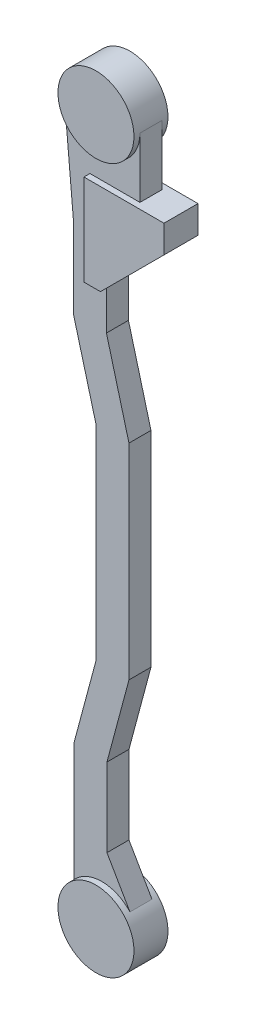
ISO-10303-21;
HEADER;
FILE_DESCRIPTION(('STEP AP214'),'2;1');
FILE_NAME('part.step','',(''),(''),'','','');
FILE_SCHEMA(('AUTOMOTIVE_DESIGN { 1 0 10303 214 1 1 1 1 }'));
ENDSEC;
DATA;
#1=APPLICATION_CONTEXT('core data for automotive mechanical design processes');
#2=APPLICATION_PROTOCOL_DEFINITION('international standard','automotive_design',2000,#1);
#3=PRODUCT_CONTEXT('',#1,'mechanical');
#4=PRODUCT('Part','Part','',(#3));
#5=PRODUCT_RELATED_PRODUCT_CATEGORY('part','',(#4));
#6=PRODUCT_DEFINITION_FORMATION('','',#4);
#7=PRODUCT_DEFINITION_CONTEXT('part definition',#1,'design');
#8=PRODUCT_DEFINITION('design','',#6,#7);
#9=PRODUCT_DEFINITION_SHAPE('','',#8);
#10=(LENGTH_UNIT() NAMED_UNIT(*) SI_UNIT(.MILLI.,.METRE.));
#11=(NAMED_UNIT(*) PLANE_ANGLE_UNIT() SI_UNIT($,.RADIAN.));
#12=(NAMED_UNIT(*) SI_UNIT($,.STERADIAN.) SOLID_ANGLE_UNIT());
#13=UNCERTAINTY_MEASURE_WITH_UNIT(LENGTH_MEASURE(1.E-05),#10,'distance_accuracy_value','');
#14=(GEOMETRIC_REPRESENTATION_CONTEXT(3) GLOBAL_UNCERTAINTY_ASSIGNED_CONTEXT((#13)) GLOBAL_UNIT_ASSIGNED_CONTEXT((#10,
#11,#12)) REPRESENTATION_CONTEXT('',''));
#15=CARTESIAN_POINT('',(0.,0.,0.));
#16=DIRECTION('',(0.,0.,1.));
#17=DIRECTION('',(1.,0.,0.));
#18=AXIS2_PLACEMENT_3D('',#15,#16,#17);
#19=CARTESIAN_POINT('',(0.,0.,-11.));
#20=DIRECTION('',(0.,0.,1.));
#21=DIRECTION('',(1.,0.,0.));
#22=AXIS2_PLACEMENT_3D('',#19,#20,#21);
#23=PLANE('',#22);
#24=DIRECTION('',(-0.499999999999995,0.866025403784442,0.));
#25=VECTOR('',#24,1.);
#26=CARTESIAN_POINT('',(32.1242977306436,18.5469719423145,-11.));
#27=LINE('',#26,#25);
#28=CARTESIAN_POINT('',(28.,25.6904651573302,-11.));
#29=VERTEX_POINT('',#28);
#30=CARTESIAN_POINT('',(5.00000000000006,65.5276337314149,-11.));
#31=VERTEX_POINT('',#30);
#32=EDGE_CURVE('E194',#29,#31,#27,.T.);
#33=ORIENTED_EDGE('',*,*,#32,.F.);
#34=CARTESIAN_POINT('',(0.,0.,-11.));
#35=DIRECTION('',(0.,0.,1.));
#36=DIRECTION('',(1.,0.,0.));
#37=AXIS2_PLACEMENT_3D('',#34,#35,#36);
#38=CIRCLE('',#37,38.);
#39=CARTESIAN_POINT('',(-28.,25.6904651573302,-11.));
#40=VERTEX_POINT('',#39);
#41=EDGE_CURVE('E188',#29,#40,#38,.T.);
#42=ORIENTED_EDGE('',*,*,#41,.T.);
#43=DIRECTION('',(0.,1.,0.));
#44=VECTOR('',#43,1.);
#45=CARTESIAN_POINT('',(-28.,0.,-11.));
#46=LINE('',#45,#44);
#47=CARTESIAN_POINT('',(-28.,144.,-11.));
#48=VERTEX_POINT('',#47);
#49=EDGE_CURVE('E191',#40,#48,#46,.T.);
#50=ORIENTED_EDGE('',*,*,#49,.T.);
#51=DIRECTION('',(0.258819045102521,0.965925826289068,0.));
#52=VECTOR('',#51,1.);
#53=CARTESIAN_POINT('',(-62.1243556529822,16.6461709275205,-11.));
#54=LINE('',#53,#52);
#55=CARTESIAN_POINT('',(-6.00038116628569,226.103695234571,-11.));
#56=VERTEX_POINT('',#55);
#57=EDGE_CURVE('E214',#48,#56,#54,.T.);
#58=ORIENTED_EDGE('',*,*,#57,.T.);
#59=DIRECTION('',(0.,1.,0.));
#60=VECTOR('',#59,1.);
#61=CARTESIAN_POINT('',(-6.00038116628571,0.,-11.));
#62=LINE('',#61,#60);
#63=CARTESIAN_POINT('',(-6.00038116628567,431.103695234571,-11.));
#64=VERTEX_POINT('',#63);
#65=EDGE_CURVE('E218',#56,#64,#62,.T.);
#66=ORIENTED_EDGE('',*,*,#65,.T.);
#67=DIRECTION('',(-0.258819045102521,0.965925826289068,0.));
#68=VECTOR('',#67,1.);
#69=CARTESIAN_POINT('',(102.177491964304,27.3783764564728,-11.));
#70=LINE('',#69,#68);
#71=CARTESIAN_POINT('',(-28.5176380902051,515.13924212172,-11.));
#72=VERTEX_POINT('',#71);
#73=EDGE_CURVE('E346',#64,#72,#70,.T.);
#74=ORIENTED_EDGE('',*,*,#73,.T.);
#75=DIRECTION('',(0.,1.,0.));
#76=VECTOR('',#75,1.);
#77=CARTESIAN_POINT('',(-28.5176380902051,0.,-11.));
#78=LINE('',#77,#76);
#79=CARTESIAN_POINT('',(-28.5176380902051,596.13924212172,-11.));
#80=VERTEX_POINT('',#79);
#81=EDGE_CURVE('E344',#72,#80,#78,.T.);
#82=ORIENTED_EDGE('',*,*,#81,.T.);
#83=DIRECTION('',(-0.0881246018637952,0.996109459119001,0.));
#84=VECTOR('',#83,1.);
#85=CARTESIAN_POINT('',(24.0339739493017,2.12625667400073,-11.));
#86=LINE('',#85,#84);
#87=CARTESIAN_POINT('',(-37.852159446522,701.651265129176,-11.));
#88=VERTEX_POINT('',#87);
#89=EDGE_CURVE('E341',#80,#88,#86,.T.);
#90=ORIENTED_EDGE('',*,*,#89,.T.);
#91=CARTESIAN_POINT('',(0.,705.,-11.));
#92=DIRECTION('',(0.,0.,1.));
#93=DIRECTION('',(1.,0.,0.));
#94=AXIS2_PLACEMENT_3D('',#91,#92,#93);
#95=CIRCLE('',#94,38.);
#96=CARTESIAN_POINT('',(38.,705.,-11.));
#97=VERTEX_POINT('',#96);
#98=EDGE_CURVE('E365',#88,#97,#95,.T.);
#99=ORIENTED_EDGE('',*,*,#98,.T.);
#100=DIRECTION('',(0.,-1.,0.));
#101=VECTOR('',#100,1.);
#102=CARTESIAN_POINT('',(37.9999999999998,0.,-11.));
#103=LINE('',#102,#101);
#104=CARTESIAN_POINT('',(38.,645.,-11.));
#105=VERTEX_POINT('',#104);
#106=EDGE_CURVE('E338',#97,#105,#103,.T.);
#107=ORIENTED_EDGE('',*,*,#106,.T.);
#108=DIRECTION('',(-1.,0.,0.));
#109=VECTOR('',#108,1.);
#110=CARTESIAN_POINT('',(0.,645.,-11.));
#111=LINE('',#110,#109);
#112=CARTESIAN_POINT('',(-12.,645.,-11.));
#113=VERTEX_POINT('',#112);
#114=EDGE_CURVE('E293',#105,#113,#111,.T.);
#115=ORIENTED_EDGE('',*,*,#114,.T.);
#116=DIRECTION('',(0.,-1.,0.));
#117=VECTOR('',#116,1.);
#118=CARTESIAN_POINT('',(-11.9999999999999,0.,-11.));
#119=LINE('',#118,#117);
#120=CARTESIAN_POINT('',(-12.,553.982361909795,-11.));
#121=VERTEX_POINT('',#120);
#122=EDGE_CURVE('E296',#113,#121,#119,.T.);
#123=ORIENTED_EDGE('',*,*,#122,.T.);
#124=DIRECTION('',(-1.,0.,0.));
#125=VECTOR('',#124,1.);
#126=CARTESIAN_POINT('',(0.,553.982361909795,-11.));
#127=LINE('',#126,#125);
#128=CARTESIAN_POINT('',(4.48236190979494,553.982361909795,-11.));
#129=VERTEX_POINT('',#128);
#130=EDGE_CURVE('E299',#129,#121,#127,.T.);
#131=ORIENTED_EDGE('',*,*,#130,.F.);
#132=DIRECTION('',(0.,1.,0.));
#133=VECTOR('',#132,1.);
#134=CARTESIAN_POINT('',(4.482361909795,0.,-11.));
#135=LINE('',#134,#133);
#136=CARTESIAN_POINT('',(4.48236190979495,515.13924212172,-11.));
#137=VERTEX_POINT('',#136);
#138=EDGE_CURVE('E230',#137,#129,#135,.T.);
#139=ORIENTED_EDGE('',*,*,#138,.F.);
#140=DIRECTION('',(-0.258819045102521,0.965925826289068,0.));
#141=VECTOR('',#140,1.);
#142=CARTESIAN_POINT('',(132.966911126747,35.6283764564728,-11.));
#143=LINE('',#142,#141);
#144=CARTESIAN_POINT('',(26.9996188337143,431.103695234571,-11.));
#145=VERTEX_POINT('',#144);
#146=EDGE_CURVE('E227',#145,#137,#143,.T.);
#147=ORIENTED_EDGE('',*,*,#146,.F.);
#148=DIRECTION('',(0.,-1.,0.));
#149=VECTOR('',#148,1.);
#150=CARTESIAN_POINT('',(26.9996188337144,0.,-11.));
#151=LINE('',#150,#149);
#152=CARTESIAN_POINT('',(26.9996188337144,226.103695234571,-11.));
#153=VERTEX_POINT('',#152);
#154=EDGE_CURVE('E225',#145,#153,#151,.T.);
#155=ORIENTED_EDGE('',*,*,#154,.T.);
#156=DIRECTION('',(-0.258819045102521,-0.965925826289068,0.));
#157=VECTOR('',#156,1.);
#158=CARTESIAN_POINT('',(-31.3349364905389,8.39617092752044,-11.));
#159=LINE('',#158,#157);
#160=CARTESIAN_POINT('',(5.00000000000005,144.,-11.));
#161=VERTEX_POINT('',#160);
#162=EDGE_CURVE('E223',#153,#161,#159,.T.);
#163=ORIENTED_EDGE('',*,*,#162,.T.);
#164=DIRECTION('',(0.,-1.,0.));
#165=VECTOR('',#164,1.);
#166=CARTESIAN_POINT('',(5.00000000000007,0.,-11.));
#167=LINE('',#166,#165);
#168=EDGE_CURVE('E216',#161,#31,#167,.T.);
#169=ORIENTED_EDGE('',*,*,#168,.T.);
#170=EDGE_LOOP('',(#33,#42,#50,#58,#66,#74,#82,#90,#99,#107,#115,#123,#131,#139,#147,#155,#163,#169));
#171=FACE_BOUND('',#170,.T.);
#172=ADVANCED_FACE('F35',(#171),#23,.F.);
#173=CARTESIAN_POINT('',(0.,0.,11.));
#174=DIRECTION('',(0.,0.,1.));
#175=DIRECTION('',(1.,0.,0.));
#176=AXIS2_PLACEMENT_3D('',#173,#174,#175);
#177=PLANE('',#176);
#178=CARTESIAN_POINT('',(0.,0.,11.));
#179=DIRECTION('',(0.,0.,1.));
#180=DIRECTION('',(1.,0.,0.));
#181=AXIS2_PLACEMENT_3D('',#178,#179,#180);
#182=CIRCLE('',#181,38.);
#183=CARTESIAN_POINT('',(28.,25.6904651573302,11.));
#184=VERTEX_POINT('',#183);
#185=CARTESIAN_POINT('',(-28.,25.6904651573302,11.));
#186=VERTEX_POINT('',#185);
#187=EDGE_CURVE('E199',#184,#186,#182,.T.);
#188=ORIENTED_EDGE('',*,*,#187,.F.);
#189=DIRECTION('',(-0.499999999999995,0.866025403784442,0.));
#190=VECTOR('',#189,1.);
#191=CARTESIAN_POINT('',(32.1242977306436,18.5469719423145,11.));
#192=LINE('',#191,#190);
#193=CARTESIAN_POINT('',(5.00000000000006,65.5276337314149,11.));
#194=VERTEX_POINT('',#193);
#195=EDGE_CURVE('E321',#184,#194,#192,.T.);
#196=ORIENTED_EDGE('',*,*,#195,.T.);
#197=DIRECTION('',(0.,-1.,0.));
#198=VECTOR('',#197,1.);
#199=CARTESIAN_POINT('',(5.00000000000007,0.,11.));
#200=LINE('',#199,#198);
#201=CARTESIAN_POINT('',(5.00000000000005,144.,11.));
#202=VERTEX_POINT('',#201);
#203=EDGE_CURVE('E324',#202,#194,#200,.T.);
#204=ORIENTED_EDGE('',*,*,#203,.F.);
#205=DIRECTION('',(-0.258819045102521,-0.965925826289068,0.));
#206=VECTOR('',#205,1.);
#207=CARTESIAN_POINT('',(-31.3349364905389,8.39617092752044,11.));
#208=LINE('',#207,#206);
#209=CARTESIAN_POINT('',(26.9996188337144,226.103695234571,11.));
#210=VERTEX_POINT('',#209);
#211=EDGE_CURVE('E327',#210,#202,#208,.T.);
#212=ORIENTED_EDGE('',*,*,#211,.F.);
#213=DIRECTION('',(0.,-1.,0.));
#214=VECTOR('',#213,1.);
#215=CARTESIAN_POINT('',(26.9996188337144,0.,11.));
#216=LINE('',#215,#214);
#217=CARTESIAN_POINT('',(26.9996188337143,431.103695234571,11.));
#218=VERTEX_POINT('',#217);
#219=EDGE_CURVE('E330',#218,#210,#216,.T.);
#220=ORIENTED_EDGE('',*,*,#219,.F.);
#221=DIRECTION('',(-0.258819045102521,0.965925826289068,0.));
#222=VECTOR('',#221,1.);
#223=CARTESIAN_POINT('',(132.966911126747,35.6283764564728,11.));
#224=LINE('',#223,#222);
#225=CARTESIAN_POINT('',(4.48236190979495,515.13924212172,11.));
#226=VERTEX_POINT('',#225);
#227=EDGE_CURVE('E333',#218,#226,#224,.T.);
#228=ORIENTED_EDGE('',*,*,#227,.T.);
#229=DIRECTION('',(0.,1.,0.));
#230=VECTOR('',#229,1.);
#231=CARTESIAN_POINT('',(4.482361909795,0.,11.));
#232=LINE('',#231,#230);
#233=CARTESIAN_POINT('',(4.48236190979494,553.982361909795,11.));
#234=VERTEX_POINT('',#233);
#235=EDGE_CURVE('E336',#226,#234,#232,.T.);
#236=ORIENTED_EDGE('',*,*,#235,.T.);
#237=DIRECTION('',(-1.,0.,0.));
#238=VECTOR('',#237,1.);
#239=CARTESIAN_POINT('',(0.,553.982361909795,11.));
#240=LINE('',#239,#238);
#241=CARTESIAN_POINT('',(-12.,553.982361909795,11.));
#242=VERTEX_POINT('',#241);
#243=EDGE_CURVE('E11',#234,#242,#240,.T.);
#244=ORIENTED_EDGE('',*,*,#243,.T.);
#245=DIRECTION('',(0.,-1.,0.));
#246=VECTOR('',#245,1.);
#247=CARTESIAN_POINT('',(-11.9999999999999,0.,11.));
#248=LINE('',#247,#246);
#249=CARTESIAN_POINT('',(-12.,645.,11.));
#250=VERTEX_POINT('',#249);
#251=EDGE_CURVE('E43',#250,#242,#248,.T.);
#252=ORIENTED_EDGE('',*,*,#251,.F.);
#253=DIRECTION('',(-1.,0.,0.));
#254=VECTOR('',#253,1.);
#255=CARTESIAN_POINT('',(0.,645.,11.));
#256=LINE('',#255,#254);
#257=CARTESIAN_POINT('',(38.,645.,11.));
#258=VERTEX_POINT('',#257);
#259=EDGE_CURVE('E236',#258,#250,#256,.T.);
#260=ORIENTED_EDGE('',*,*,#259,.F.);
#261=DIRECTION('',(0.,-1.,0.));
#262=VECTOR('',#261,1.);
#263=CARTESIAN_POINT('',(37.9999999999998,0.,11.));
#264=LINE('',#263,#262);
#265=CARTESIAN_POINT('',(38.,705.,11.));
#266=VERTEX_POINT('',#265);
#267=EDGE_CURVE('E301',#266,#258,#264,.T.);
#268=ORIENTED_EDGE('',*,*,#267,.F.);
#269=CARTESIAN_POINT('',(0.,705.,11.));
#270=DIRECTION('',(0.,0.,1.));
#271=DIRECTION('',(1.,0.,0.));
#272=AXIS2_PLACEMENT_3D('',#269,#270,#271);
#273=CIRCLE('',#272,38.);
#274=CARTESIAN_POINT('',(-37.852159446522,701.651265129176,11.));
#275=VERTEX_POINT('',#274);
#276=EDGE_CURVE('E374',#275,#266,#273,.T.);
#277=ORIENTED_EDGE('',*,*,#276,.F.);
#278=DIRECTION('',(-0.0881246018637952,0.996109459119001,0.));
#279=VECTOR('',#278,1.);
#280=CARTESIAN_POINT('',(24.0339739493017,2.12625667400073,11.));
#281=LINE('',#280,#279);
#282=CARTESIAN_POINT('',(-28.5176380902051,596.13924212172,11.));
#283=VERTEX_POINT('',#282);
#284=EDGE_CURVE('E304',#283,#275,#281,.T.);
#285=ORIENTED_EDGE('',*,*,#284,.F.);
#286=DIRECTION('',(0.,1.,0.));
#287=VECTOR('',#286,1.);
#288=CARTESIAN_POINT('',(-28.5176380902051,0.,11.));
#289=LINE('',#288,#287);
#290=CARTESIAN_POINT('',(-28.5176380902051,515.13924212172,11.));
#291=VERTEX_POINT('',#290);
#292=EDGE_CURVE('E307',#291,#283,#289,.T.);
#293=ORIENTED_EDGE('',*,*,#292,.F.);
#294=DIRECTION('',(-0.258819045102521,0.965925826289068,0.));
#295=VECTOR('',#294,1.);
#296=CARTESIAN_POINT('',(102.177491964304,27.3783764564728,11.));
#297=LINE('',#296,#295);
#298=CARTESIAN_POINT('',(-6.00038116628567,431.103695234571,11.));
#299=VERTEX_POINT('',#298);
#300=EDGE_CURVE('E310',#299,#291,#297,.T.);
#301=ORIENTED_EDGE('',*,*,#300,.F.);
#302=DIRECTION('',(0.,1.,0.));
#303=VECTOR('',#302,1.);
#304=CARTESIAN_POINT('',(-6.00038116628571,0.,11.));
#305=LINE('',#304,#303);
#306=CARTESIAN_POINT('',(-6.00038116628569,226.103695234571,11.));
#307=VERTEX_POINT('',#306);
#308=EDGE_CURVE('E313',#307,#299,#305,.T.);
#309=ORIENTED_EDGE('',*,*,#308,.F.);
#310=DIRECTION('',(0.258819045102521,0.965925826289068,0.));
#311=VECTOR('',#310,1.);
#312=CARTESIAN_POINT('',(-62.1243556529822,16.6461709275205,11.));
#313=LINE('',#312,#311);
#314=CARTESIAN_POINT('',(-28.,144.,11.));
#315=VERTEX_POINT('',#314);
#316=EDGE_CURVE('E316',#315,#307,#313,.T.);
#317=ORIENTED_EDGE('',*,*,#316,.F.);
#318=DIRECTION('',(0.,1.,0.));
#319=VECTOR('',#318,1.);
#320=CARTESIAN_POINT('',(-28.,0.,11.));
#321=LINE('',#320,#319);
#322=EDGE_CURVE('E319',#186,#315,#321,.T.);
#323=ORIENTED_EDGE('',*,*,#322,.F.);
#324=EDGE_LOOP('',(#188,#196,#204,#212,#220,#228,#236,#244,#252,#260,#268,#277,#285,#293,#301,
#309,#317,#323));
#325=FACE_BOUND('',#324,.T.);
#326=ADVANCED_FACE('F424',(#325),#177,.T.);
#327=CARTESIAN_POINT('',(0.,645.,-11.));
#328=DIRECTION('',(0.,-1.,0.));
#329=DIRECTION('',(0.,0.,-1.));
#330=AXIS2_PLACEMENT_3D('',#327,#328,#329);
#331=PLANE('',#330);
#332=DIRECTION('',(0.,0.,1.));
#333=VECTOR('',#332,1.);
#334=CARTESIAN_POINT('',(38.,645.,-11.));
#335=LINE('',#334,#333);
#336=EDGE_CURVE('E233',#105,#258,#335,.T.);
#337=ORIENTED_EDGE('',*,*,#336,.T.);
#338=ORIENTED_EDGE('',*,*,#259,.T.);
#339=DIRECTION('',(0.,0.,1.));
#340=VECTOR('',#339,1.);
#341=CARTESIAN_POINT('',(-12.,645.,-17.));
#342=LINE('',#341,#340);
#343=CARTESIAN_POINT('',(-12.,645.,17.));
#344=VERTEX_POINT('',#343);
#345=EDGE_CURVE('E277',#250,#344,#342,.T.);
#346=ORIENTED_EDGE('',*,*,#345,.T.);
#347=DIRECTION('',(-1.,0.,0.));
#348=VECTOR('',#347,1.);
#349=CARTESIAN_POINT('',(68.,645.,17.));
#350=LINE('',#349,#348);
#351=CARTESIAN_POINT('',(68.,645.,17.));
#352=VERTEX_POINT('',#351);
#353=EDGE_CURVE('E390',#352,#344,#350,.T.);
#354=ORIENTED_EDGE('',*,*,#353,.F.);
#355=DIRECTION('',(0.,0.,1.));
#356=VECTOR('',#355,1.);
#357=CARTESIAN_POINT('',(68.,645.,-11.));
#358=LINE('',#357,#356);
#359=CARTESIAN_POINT('',(68.,645.,-17.));
#360=VERTEX_POINT('',#359);
#361=EDGE_CURVE('E234',#360,#352,#358,.T.);
#362=ORIENTED_EDGE('',*,*,#361,.F.);
#363=DIRECTION('',(-1.,0.,0.));
#364=VECTOR('',#363,1.);
#365=CARTESIAN_POINT('',(68.,645.,-17.));
#366=LINE('',#365,#364);
#367=CARTESIAN_POINT('',(-12.,645.,-17.));
#368=VERTEX_POINT('',#367);
#369=EDGE_CURVE('E402',#360,#368,#366,.T.);
#370=ORIENTED_EDGE('',*,*,#369,.T.);
#371=EDGE_CURVE('E50',#368,#113,#342,.T.);
#372=ORIENTED_EDGE('',*,*,#371,.T.);
#373=ORIENTED_EDGE('',*,*,#114,.F.);
#374=EDGE_LOOP('',(#337,#338,#346,#354,#362,#370,#372,#373));
#375=FACE_BOUND('',#374,.T.);
#376=ADVANCED_FACE('F37',(#375),#331,.F.);
#377=CARTESIAN_POINT('',(68.,0.,-11.));
#378=DIRECTION('',(1.,0.,0.));
#379=DIRECTION('',(0.,0.,-1.));
#380=AXIS2_PLACEMENT_3D('',#377,#378,#379);
#381=PLANE('',#380);
#382=ORIENTED_EDGE('',*,*,#361,.T.);
#383=DIRECTION('',(0.,-1.,0.));
#384=VECTOR('',#383,1.);
#385=CARTESIAN_POINT('',(68.,645.,17.));
#386=LINE('',#385,#384);
#387=CARTESIAN_POINT('',(68.,617.5,17.));
#388=VERTEX_POINT('',#387);
#389=EDGE_CURVE('E376',#352,#388,#386,.T.);
#390=ORIENTED_EDGE('',*,*,#389,.T.);
#391=DIRECTION('',(0.,0.,1.));
#392=VECTOR('',#391,1.);
#393=CARTESIAN_POINT('',(68.,617.5,-11.));
#394=LINE('',#393,#392);
#395=CARTESIAN_POINT('',(68.,617.5,-17.));
#396=VERTEX_POINT('',#395);
#397=EDGE_CURVE('E237',#396,#388,#394,.T.);
#398=ORIENTED_EDGE('',*,*,#397,.F.);
#399=DIRECTION('',(0.,-1.,0.));
#400=VECTOR('',#399,1.);
#401=CARTESIAN_POINT('',(68.,645.,-17.));
#402=LINE('',#401,#400);
#403=EDGE_CURVE('E393',#360,#396,#402,.T.);
#404=ORIENTED_EDGE('',*,*,#403,.F.);
#405=EDGE_LOOP('',(#382,#390,#398,#404));
#406=FACE_BOUND('',#405,.T.);
#407=ADVANCED_FACE('F410',(#406),#381,.T.);
#408=CARTESIAN_POINT('',(-274.75,274.750000000001,-11.));
#409=DIRECTION('',(-0.707106781186547,0.707106781186548,0.));
#410=DIRECTION('',(-0.707106781186548,-0.707106781186547,0.));
#411=AXIS2_PLACEMENT_3D('',#408,#409,#410);
#412=PLANE('',#411);
#413=ORIENTED_EDGE('',*,*,#397,.T.);
#414=DIRECTION('',(-0.707106781186548,-0.707106781186547,0.));
#415=VECTOR('',#414,1.);
#416=CARTESIAN_POINT('',(68.,617.5,17.));
#417=LINE('',#416,#415);
#418=CARTESIAN_POINT('',(4.48236190979494,553.982361909795,17.));
#419=VERTEX_POINT('',#418);
#420=EDGE_CURVE('E379',#388,#419,#417,.T.);
#421=ORIENTED_EDGE('',*,*,#420,.T.);
#422=DIRECTION('',(0.,0.,1.));
#423=VECTOR('',#422,1.);
#424=CARTESIAN_POINT('',(4.48236190979494,553.982361909795,-17.));
#425=LINE('',#424,#423);
#426=EDGE_CURVE('E287',#234,#419,#425,.T.);
#427=ORIENTED_EDGE('',*,*,#426,.F.);
#428=DIRECTION('',(0.,0.,1.));
#429=VECTOR('',#428,1.);
#430=CARTESIAN_POINT('',(4.48236190979494,553.982361909795,-11.));
#431=LINE('',#430,#429);
#432=EDGE_CURVE('E239',#129,#234,#431,.T.);
#433=ORIENTED_EDGE('',*,*,#432,.F.);
#434=CARTESIAN_POINT('',(4.48236190979494,553.982361909795,-17.));
#435=VERTEX_POINT('',#434);
#436=EDGE_CURVE('E291',#435,#129,#425,.T.);
#437=ORIENTED_EDGE('',*,*,#436,.F.);
#438=DIRECTION('',(-0.707106781186548,-0.707106781186547,0.));
#439=VECTOR('',#438,1.);
#440=CARTESIAN_POINT('',(68.,617.5,-17.));
#441=LINE('',#440,#439);
#442=EDGE_CURVE('E396',#396,#435,#441,.T.);
#443=ORIENTED_EDGE('',*,*,#442,.F.);
#444=EDGE_LOOP('',(#413,#421,#427,#433,#437,#443));
#445=FACE_BOUND('',#444,.T.);
#446=ADVANCED_FACE('F446',(#445),#412,.F.);
#447=CARTESIAN_POINT('',(4.482361909795,0.,-11.));
#448=DIRECTION('',(1.,0.,0.));
#449=DIRECTION('',(0.,1.,0.));
#450=AXIS2_PLACEMENT_3D('',#447,#448,#449);
#451=PLANE('',#450);
#452=ORIENTED_EDGE('',*,*,#432,.T.);
#453=ORIENTED_EDGE('',*,*,#235,.F.);
#454=DIRECTION('',(0.,0.,1.));
#455=VECTOR('',#454,1.);
#456=CARTESIAN_POINT('',(4.48236190979495,515.13924212172,-11.));
#457=LINE('',#456,#455);
#458=EDGE_CURVE('E241',#137,#226,#457,.T.);
#459=ORIENTED_EDGE('',*,*,#458,.F.);
#460=ORIENTED_EDGE('',*,*,#138,.T.);
#461=EDGE_LOOP('',(#452,#453,#459,#460));
#462=FACE_BOUND('',#461,.T.);
#463=ADVANCED_FACE('F449',(#462),#451,.T.);
#464=CARTESIAN_POINT('',(132.966911126747,35.6283764564728,-11.));
#465=DIRECTION('',(0.965925826289068,0.258819045102521,0.));
#466=DIRECTION('',(-0.258819045102521,0.965925826289068,0.));
#467=AXIS2_PLACEMENT_3D('',#464,#465,#466);
#468=PLANE('',#467);
#469=ORIENTED_EDGE('',*,*,#458,.T.);
#470=ORIENTED_EDGE('',*,*,#227,.F.);
#471=DIRECTION('',(0.,0.,1.));
#472=VECTOR('',#471,1.);
#473=CARTESIAN_POINT('',(26.9996188337143,431.103695234571,-11.));
#474=LINE('',#473,#472);
#475=EDGE_CURVE('E243',#145,#218,#474,.T.);
#476=ORIENTED_EDGE('',*,*,#475,.F.);
#477=ORIENTED_EDGE('',*,*,#146,.T.);
#478=EDGE_LOOP('',(#469,#470,#476,#477));
#479=FACE_BOUND('',#478,.T.);
#480=ADVANCED_FACE('F453',(#479),#468,.T.);
#481=CARTESIAN_POINT('',(26.9996188337144,0.,-11.));
#482=DIRECTION('',(-1.,0.,0.));
#483=DIRECTION('',(0.,-1.,0.));
#484=AXIS2_PLACEMENT_3D('',#481,#482,#483);
#485=PLANE('',#484);
#486=ORIENTED_EDGE('',*,*,#475,.T.);
#487=ORIENTED_EDGE('',*,*,#219,.T.);
#488=DIRECTION('',(0.,0.,1.));
#489=VECTOR('',#488,1.);
#490=CARTESIAN_POINT('',(26.9996188337144,226.103695234571,-11.));
#491=LINE('',#490,#489);
#492=EDGE_CURVE('E245',#153,#210,#491,.T.);
#493=ORIENTED_EDGE('',*,*,#492,.F.);
#494=ORIENTED_EDGE('',*,*,#154,.F.);
#495=EDGE_LOOP('',(#486,#487,#493,#494));
#496=FACE_BOUND('',#495,.T.);
#497=ADVANCED_FACE('F457',(#496),#485,.F.);
#498=CARTESIAN_POINT('',(-31.3349364905389,8.39617092752044,-11.));
#499=DIRECTION('',(-0.965925826289068,0.258819045102521,0.));
#500=DIRECTION('',(-0.258819045102521,-0.965925826289068,0.));
#501=AXIS2_PLACEMENT_3D('',#498,#499,#500);
#502=PLANE('',#501);
#503=ORIENTED_EDGE('',*,*,#492,.T.);
#504=ORIENTED_EDGE('',*,*,#211,.T.);
#505=DIRECTION('',(0.,0.,1.));
#506=VECTOR('',#505,1.);
#507=CARTESIAN_POINT('',(5.00000000000005,144.,-11.));
#508=LINE('',#507,#506);
#509=EDGE_CURVE('E247',#161,#202,#508,.T.);
#510=ORIENTED_EDGE('',*,*,#509,.F.);
#511=ORIENTED_EDGE('',*,*,#162,.F.);
#512=EDGE_LOOP('',(#503,#504,#510,#511));
#513=FACE_BOUND('',#512,.T.);
#514=ADVANCED_FACE('F461',(#513),#502,.F.);
#515=CARTESIAN_POINT('',(5.00000000000007,0.,-11.));
#516=DIRECTION('',(-1.,0.,0.));
#517=DIRECTION('',(0.,-1.,0.));
#518=AXIS2_PLACEMENT_3D('',#515,#516,#517);
#519=PLANE('',#518);
#520=ORIENTED_EDGE('',*,*,#509,.T.);
#521=ORIENTED_EDGE('',*,*,#203,.T.);
#522=DIRECTION('',(0.,0.,1.));
#523=VECTOR('',#522,1.);
#524=CARTESIAN_POINT('',(5.00000000000006,65.5276337314149,-11.));
#525=LINE('',#524,#523);
#526=EDGE_CURVE('E249',#31,#194,#525,.T.);
#527=ORIENTED_EDGE('',*,*,#526,.F.);
#528=ORIENTED_EDGE('',*,*,#168,.F.);
#529=EDGE_LOOP('',(#520,#521,#527,#528));
#530=FACE_BOUND('',#529,.T.);
#531=ADVANCED_FACE('F465',(#530),#519,.F.);
#532=CARTESIAN_POINT('',(32.1242977306436,18.5469719423145,-11.));
#533=DIRECTION('',(0.866025403784442,0.499999999999995,0.));
#534=DIRECTION('',(-0.499999999999995,0.866025403784442,0.));
#535=AXIS2_PLACEMENT_3D('',#532,#533,#534);
#536=PLANE('',#535);
#537=ORIENTED_EDGE('',*,*,#526,.T.);
#538=ORIENTED_EDGE('',*,*,#195,.F.);
#539=DIRECTION('',(0.,0.,1.));
#540=VECTOR('',#539,1.);
#541=CARTESIAN_POINT('',(28.,25.6904651573302,-11.));
#542=LINE('',#541,#540);
#543=EDGE_CURVE('E209',#29,#184,#542,.T.);
#544=ORIENTED_EDGE('',*,*,#543,.F.);
#545=ORIENTED_EDGE('',*,*,#32,.T.);
#546=EDGE_LOOP('',(#537,#538,#544,#545));
#547=FACE_BOUND('',#546,.T.);
#548=ADVANCED_FACE('F469',(#547),#536,.T.);
#549=CARTESIAN_POINT('',(0.,0.,-11.));
#550=DIRECTION('',(0.,0.,1.));
#551=DIRECTION('',(1.,0.,0.));
#552=AXIS2_PLACEMENT_3D('',#549,#550,#551);
#553=CYLINDRICAL_SURFACE('',#552,38.);
#554=ORIENTED_EDGE('',*,*,#543,.T.);
#555=ORIENTED_EDGE('',*,*,#187,.T.);
#556=DIRECTION('',(0.,0.,1.));
#557=VECTOR('',#556,1.);
#558=CARTESIAN_POINT('',(-28.,25.6904651573302,-11.));
#559=LINE('',#558,#557);
#560=EDGE_CURVE('E202',#40,#186,#559,.T.);
#561=ORIENTED_EDGE('',*,*,#560,.F.);
#562=ORIENTED_EDGE('',*,*,#41,.F.);
#563=EDGE_LOOP('',(#554,#555,#561,#562));
#564=FACE_BOUND('',#563,.T.);
#565=CARTESIAN_POINT('',(0.,0.,17.));
#566=DIRECTION('',(0.,0.,1.));
#567=DIRECTION('',(1.,0.,0.));
#568=AXIS2_PLACEMENT_3D('',#565,#566,#567);
#569=CIRCLE('',#568,38.);
#570=CARTESIAN_POINT('',(38.,0.,17.));
#571=VERTEX_POINT('',#570);
#572=EDGE_CURVE('E607',#571,#571,#569,.T.);
#573=ORIENTED_EDGE('',*,*,#572,.F.);
#574=EDGE_LOOP('',(#573));
#575=FACE_BOUND('',#574,.T.);
#576=CARTESIAN_POINT('',(0.,0.,-17.));
#577=DIRECTION('',(0.,0.,1.));
#578=DIRECTION('',(1.,0.,0.));
#579=AXIS2_PLACEMENT_3D('',#576,#577,#578);
#580=CIRCLE('',#579,38.);
#581=CARTESIAN_POINT('',(38.,0.,-17.));
#582=VERTEX_POINT('',#581);
#583=EDGE_CURVE('E605',#582,#582,#580,.T.);
#584=ORIENTED_EDGE('',*,*,#583,.T.);
#585=EDGE_LOOP('',(#584));
#586=FACE_BOUND('',#585,.T.);
#587=ADVANCED_FACE('F203',(#564,#575,#586),#553,.T.);
#588=CARTESIAN_POINT('',(-28.,0.,-11.));
#589=DIRECTION('',(1.,0.,0.));
#590=DIRECTION('',(0.,0.,-1.));
#591=AXIS2_PLACEMENT_3D('',#588,#589,#590);
#592=PLANE('',#591);
#593=ORIENTED_EDGE('',*,*,#560,.T.);
#594=ORIENTED_EDGE('',*,*,#322,.T.);
#595=DIRECTION('',(0.,0.,1.));
#596=VECTOR('',#595,1.);
#597=CARTESIAN_POINT('',(-28.,144.,-11.));
#598=LINE('',#597,#596);
#599=EDGE_CURVE('E210',#48,#315,#598,.T.);
#600=ORIENTED_EDGE('',*,*,#599,.F.);
#601=ORIENTED_EDGE('',*,*,#49,.F.);
#602=EDGE_LOOP('',(#593,#594,#600,#601));
#603=FACE_BOUND('',#602,.T.);
#604=ADVANCED_FACE('F212',(#603),#592,.F.);
#605=CARTESIAN_POINT('',(-62.1243556529822,16.6461709275205,-11.));
#606=DIRECTION('',(0.965925826289068,-0.258819045102521,0.));
#607=DIRECTION('',(0.258819045102521,0.965925826289068,0.));
#608=AXIS2_PLACEMENT_3D('',#605,#606,#607);
#609=PLANE('',#608);
#610=ORIENTED_EDGE('',*,*,#599,.T.);
#611=ORIENTED_EDGE('',*,*,#316,.T.);
#612=DIRECTION('',(0.,0.,1.));
#613=VECTOR('',#612,1.);
#614=CARTESIAN_POINT('',(-6.00038116628569,226.103695234571,-11.));
#615=LINE('',#614,#613);
#616=EDGE_CURVE('E253',#56,#307,#615,.T.);
#617=ORIENTED_EDGE('',*,*,#616,.F.);
#618=ORIENTED_EDGE('',*,*,#57,.F.);
#619=EDGE_LOOP('',(#610,#611,#617,#618));
#620=FACE_BOUND('',#619,.T.);
#621=ADVANCED_FACE('F427',(#620),#609,.F.);
#622=CARTESIAN_POINT('',(-6.00038116628571,0.,-11.));
#623=DIRECTION('',(1.,0.,0.));
#624=DIRECTION('',(0.,1.,0.));
#625=AXIS2_PLACEMENT_3D('',#622,#623,#624);
#626=PLANE('',#625);
#627=ORIENTED_EDGE('',*,*,#616,.T.);
#628=ORIENTED_EDGE('',*,*,#308,.T.);
#629=DIRECTION('',(0.,0.,1.));
#630=VECTOR('',#629,1.);
#631=CARTESIAN_POINT('',(-6.00038116628567,431.103695234571,-11.));
#632=LINE('',#631,#630);
#633=EDGE_CURVE('E255',#64,#299,#632,.T.);
#634=ORIENTED_EDGE('',*,*,#633,.F.);
#635=ORIENTED_EDGE('',*,*,#65,.F.);
#636=EDGE_LOOP('',(#627,#628,#634,#635));
#637=FACE_BOUND('',#636,.T.);
#638=ADVANCED_FACE('F353',(#637),#626,.F.);
#639=CARTESIAN_POINT('',(102.177491964304,27.3783764564728,-11.));
#640=DIRECTION('',(0.965925826289068,0.258819045102521,0.));
#641=DIRECTION('',(-0.258819045102521,0.965925826289068,0.));
#642=AXIS2_PLACEMENT_3D('',#639,#640,#641);
#643=PLANE('',#642);
#644=ORIENTED_EDGE('',*,*,#633,.T.);
#645=ORIENTED_EDGE('',*,*,#300,.T.);
#646=DIRECTION('',(0.,0.,1.));
#647=VECTOR('',#646,1.);
#648=CARTESIAN_POINT('',(-28.5176380902051,515.13924212172,-11.));
#649=LINE('',#648,#647);
#650=EDGE_CURVE('E257',#72,#291,#649,.T.);
#651=ORIENTED_EDGE('',*,*,#650,.F.);
#652=ORIENTED_EDGE('',*,*,#73,.F.);
#653=EDGE_LOOP('',(#644,#645,#651,#652));
#654=FACE_BOUND('',#653,.T.);
#655=ADVANCED_FACE('F357',(#654),#643,.F.);
#656=CARTESIAN_POINT('',(-28.5176380902051,0.,-11.));
#657=DIRECTION('',(1.,0.,0.));
#658=DIRECTION('',(0.,0.,-1.));
#659=AXIS2_PLACEMENT_3D('',#656,#657,#658);
#660=PLANE('',#659);
#661=ORIENTED_EDGE('',*,*,#650,.T.);
#662=ORIENTED_EDGE('',*,*,#292,.T.);
#663=DIRECTION('',(0.,0.,1.));
#664=VECTOR('',#663,1.);
#665=CARTESIAN_POINT('',(-28.5176380902051,596.13924212172,-11.));
#666=LINE('',#665,#664);
#667=EDGE_CURVE('E259',#80,#283,#666,.T.);
#668=ORIENTED_EDGE('',*,*,#667,.F.);
#669=ORIENTED_EDGE('',*,*,#81,.F.);
#670=EDGE_LOOP('',(#661,#662,#668,#669));
#671=FACE_BOUND('',#670,.T.);
#672=ADVANCED_FACE('F362',(#671),#660,.F.);
#673=CARTESIAN_POINT('',(24.0339739493017,2.12625667400073,-11.));
#674=DIRECTION('',(0.996109459119001,0.0881246018637952,0.));
#675=DIRECTION('',(-0.0881246018637951,0.996109459119,0.));
#676=AXIS2_PLACEMENT_3D('',#673,#674,#675);
#677=PLANE('',#676);
#678=ORIENTED_EDGE('',*,*,#667,.T.);
#679=ORIENTED_EDGE('',*,*,#284,.T.);
#680=DIRECTION('',(0.,0.,1.));
#681=VECTOR('',#680,1.);
#682=CARTESIAN_POINT('',(-37.852159446522,701.651265129176,-11.));
#683=LINE('',#682,#681);
#684=EDGE_CURVE('E261',#88,#275,#683,.T.);
#685=ORIENTED_EDGE('',*,*,#684,.F.);
#686=ORIENTED_EDGE('',*,*,#89,.F.);
#687=EDGE_LOOP('',(#678,#679,#685,#686));
#688=FACE_BOUND('',#687,.T.);
#689=ADVANCED_FACE('F368',(#688),#677,.F.);
#690=CARTESIAN_POINT('',(0.,705.,-11.));
#691=DIRECTION('',(0.,0.,1.));
#692=DIRECTION('',(1.,0.,0.));
#693=AXIS2_PLACEMENT_3D('',#690,#691,#692);
#694=CYLINDRICAL_SURFACE('',#693,38.);
#695=ORIENTED_EDGE('',*,*,#684,.T.);
#696=ORIENTED_EDGE('',*,*,#276,.T.);
#697=DIRECTION('',(0.,0.,1.));
#698=VECTOR('',#697,1.);
#699=CARTESIAN_POINT('',(38.,705.,-11.));
#700=LINE('',#699,#698);
#701=EDGE_CURVE('E264',#97,#266,#700,.T.);
#702=ORIENTED_EDGE('',*,*,#701,.F.);
#703=ORIENTED_EDGE('',*,*,#98,.F.);
#704=EDGE_LOOP('',(#695,#696,#702,#703));
#705=FACE_BOUND('',#704,.T.);
#706=CARTESIAN_POINT('',(0.,705.,17.));
#707=DIRECTION('',(0.,0.,1.));
#708=DIRECTION('',(1.,0.,0.));
#709=AXIS2_PLACEMENT_3D('',#706,#707,#708);
#710=CIRCLE('',#709,38.);
#711=CARTESIAN_POINT('',(38.,705.,17.));
#712=VERTEX_POINT('',#711);
#713=EDGE_CURVE('E381',#712,#712,#710,.T.);
#714=ORIENTED_EDGE('',*,*,#713,.F.);
#715=EDGE_LOOP('',(#714));
#716=FACE_BOUND('',#715,.T.);
#717=CARTESIAN_POINT('',(0.,705.,-17.));
#718=DIRECTION('',(0.,0.,1.));
#719=DIRECTION('',(1.,0.,0.));
#720=AXIS2_PLACEMENT_3D('',#717,#718,#719);
#721=CIRCLE('',#720,38.);
#722=CARTESIAN_POINT('',(38.,705.,-17.));
#723=VERTEX_POINT('',#722);
#724=EDGE_CURVE('E198',#723,#723,#721,.T.);
#725=ORIENTED_EDGE('',*,*,#724,.T.);
#726=EDGE_LOOP('',(#725));
#727=FACE_BOUND('',#726,.T.);
#728=ADVANCED_FACE('F372',(#705,#716,#727),#694,.T.);
#729=CARTESIAN_POINT('',(37.9999999999998,0.,-11.));
#730=DIRECTION('',(-1.,0.,0.));
#731=DIRECTION('',(0.,-1.,0.));
#732=AXIS2_PLACEMENT_3D('',#729,#730,#731);
#733=PLANE('',#732);
#734=ORIENTED_EDGE('',*,*,#701,.T.);
#735=ORIENTED_EDGE('',*,*,#267,.T.);
#736=ORIENTED_EDGE('',*,*,#336,.F.);
#737=ORIENTED_EDGE('',*,*,#106,.F.);
#738=EDGE_LOOP('',(#734,#735,#736,#737));
#739=FACE_BOUND('',#738,.T.);
#740=ADVANCED_FACE('F423',(#739),#733,.F.);
#741=CARTESIAN_POINT('',(0.,0.,17.));
#742=DIRECTION('',(0.,0.,-1.));
#743=DIRECTION('',(-1.,0.,0.));
#744=AXIS2_PLACEMENT_3D('',#741,#742,#743);
#745=PLANE('',#744);
#746=ORIENTED_EDGE('',*,*,#389,.F.);
#747=ORIENTED_EDGE('',*,*,#353,.T.);
#748=DIRECTION('',(0.,-1.,0.));
#749=VECTOR('',#748,1.);
#750=CARTESIAN_POINT('',(-12.,645.,17.));
#751=LINE('',#750,#749);
#752=CARTESIAN_POINT('',(-12.,553.982361909795,17.));
#753=VERTEX_POINT('',#752);
#754=EDGE_CURVE('E388',#344,#753,#751,.T.);
#755=ORIENTED_EDGE('',*,*,#754,.T.);
#756=DIRECTION('',(-1.,0.,0.));
#757=VECTOR('',#756,1.);
#758=CARTESIAN_POINT('',(4.48236190979494,553.982361909795,17.));
#759=LINE('',#758,#757);
#760=EDGE_CURVE('E283',#419,#753,#759,.T.);
#761=ORIENTED_EDGE('',*,*,#760,.F.);
#762=ORIENTED_EDGE('',*,*,#420,.F.);
#763=EDGE_LOOP('',(#746,#747,#755,#761,#762));
#764=FACE_BOUND('',#763,.T.);
#765=ADVANCED_FACE('F407',(#764),#745,.F.);
#766=CARTESIAN_POINT('',(-12.,645.,-17.));
#767=DIRECTION('',(-1.,0.,0.));
#768=DIRECTION('',(0.,-1.,0.));
#769=AXIS2_PLACEMENT_3D('',#766,#767,#768);
#770=PLANE('',#769);
#771=ORIENTED_EDGE('',*,*,#345,.F.);
#772=ORIENTED_EDGE('',*,*,#251,.T.);
#773=DIRECTION('',(0.,0.,1.));
#774=VECTOR('',#773,1.);
#775=CARTESIAN_POINT('',(-12.,553.982361909795,-17.));
#776=LINE('',#775,#774);
#777=EDGE_CURVE('E275',#242,#753,#776,.T.);
#778=ORIENTED_EDGE('',*,*,#777,.T.);
#779=ORIENTED_EDGE('',*,*,#754,.F.);
#780=EDGE_LOOP('',(#771,#772,#778,#779));
#781=FACE_BOUND('',#780,.T.);
#782=ADVANCED_FACE('F273',(#781),#770,.T.);
#783=CARTESIAN_POINT('',(4.48236190979494,553.982361909795,-17.));
#784=DIRECTION('',(0.,1.,0.));
#785=DIRECTION('',(0.,0.,1.));
#786=AXIS2_PLACEMENT_3D('',#783,#784,#785);
#787=PLANE('',#786);
#788=ORIENTED_EDGE('',*,*,#243,.F.);
#789=ORIENTED_EDGE('',*,*,#426,.T.);
#790=ORIENTED_EDGE('',*,*,#760,.T.);
#791=ORIENTED_EDGE('',*,*,#777,.F.);
#792=EDGE_LOOP('',(#788,#789,#790,#791));
#793=FACE_BOUND('',#792,.T.);
#794=ADVANCED_FACE('F280',(#793),#787,.F.);
#795=ORIENTED_EDGE('',*,*,#436,.T.);
#796=ORIENTED_EDGE('',*,*,#130,.T.);
#797=CARTESIAN_POINT('',(-12.,553.982361909795,-17.));
#798=VERTEX_POINT('',#797);
#799=EDGE_CURVE('E284',#798,#121,#776,.T.);
#800=ORIENTED_EDGE('',*,*,#799,.F.);
#801=DIRECTION('',(-1.,0.,0.));
#802=VECTOR('',#801,1.);
#803=CARTESIAN_POINT('',(4.48236190979494,553.982361909795,-17.));
#804=LINE('',#803,#802);
#805=EDGE_CURVE('E398',#435,#798,#804,.T.);
#806=ORIENTED_EDGE('',*,*,#805,.F.);
#807=EDGE_LOOP('',(#795,#796,#800,#806));
#808=FACE_BOUND('',#807,.T.);
#809=ADVANCED_FACE('F537',(#808),#787,.F.);
#810=ORIENTED_EDGE('',*,*,#122,.F.);
#811=ORIENTED_EDGE('',*,*,#371,.F.);
#812=DIRECTION('',(0.,-1.,0.));
#813=VECTOR('',#812,1.);
#814=CARTESIAN_POINT('',(-12.,645.,-17.));
#815=LINE('',#814,#813);
#816=EDGE_CURVE('E400',#368,#798,#815,.T.);
#817=ORIENTED_EDGE('',*,*,#816,.T.);
#818=ORIENTED_EDGE('',*,*,#799,.T.);
#819=EDGE_LOOP('',(#810,#811,#817,#818));
#820=FACE_BOUND('',#819,.T.);
#821=ADVANCED_FACE('F419',(#820),#770,.T.);
#822=CARTESIAN_POINT('',(0.,0.,-17.));
#823=DIRECTION('',(0.,0.,-1.));
#824=DIRECTION('',(-1.,0.,0.));
#825=AXIS2_PLACEMENT_3D('',#822,#823,#824);
#826=PLANE('',#825);
#827=ORIENTED_EDGE('',*,*,#403,.T.);
#828=ORIENTED_EDGE('',*,*,#442,.T.);
#829=ORIENTED_EDGE('',*,*,#805,.T.);
#830=ORIENTED_EDGE('',*,*,#816,.F.);
#831=ORIENTED_EDGE('',*,*,#369,.F.);
#832=EDGE_LOOP('',(#827,#828,#829,#830,#831));
#833=FACE_BOUND('',#832,.T.);
#834=ADVANCED_FACE('F415',(#833),#826,.T.);
#835=CARTESIAN_POINT('',(0.,705.,17.));
#836=DIRECTION('',(0.,0.,1.));
#837=DIRECTION('',(1.,0.,0.));
#838=AXIS2_PLACEMENT_3D('',#835,#836,#837);
#839=PLANE('',#838);
#840=ORIENTED_EDGE('',*,*,#713,.T.);
#841=EDGE_LOOP('',(#840));
#842=FACE_BOUND('',#841,.T.);
#843=ADVANCED_FACE('F560',(#842),#839,.T.);
#844=CARTESIAN_POINT('',(0.,705.,-17.));
#845=DIRECTION('',(0.,0.,1.));
#846=DIRECTION('',(1.,0.,0.));
#847=AXIS2_PLACEMENT_3D('',#844,#845,#846);
#848=PLANE('',#847);
#849=ORIENTED_EDGE('',*,*,#724,.F.);
#850=EDGE_LOOP('',(#849));
#851=FACE_BOUND('',#850,.T.);
#852=ADVANCED_FACE('F569',(#851),#848,.F.);
#853=CARTESIAN_POINT('',(0.,0.,17.));
#854=DIRECTION('',(0.,0.,1.));
#855=DIRECTION('',(1.,0.,0.));
#856=AXIS2_PLACEMENT_3D('',#853,#854,#855);
#857=PLANE('',#856);
#858=ORIENTED_EDGE('',*,*,#572,.T.);
#859=EDGE_LOOP('',(#858));
#860=FACE_BOUND('',#859,.T.);
#861=ADVANCED_FACE('F579',(#860),#857,.T.);
#862=CARTESIAN_POINT('',(0.,0.,-17.));
#863=DIRECTION('',(0.,0.,1.));
#864=DIRECTION('',(1.,0.,0.));
#865=AXIS2_PLACEMENT_3D('',#862,#863,#864);
#866=PLANE('',#865);
#867=ORIENTED_EDGE('',*,*,#583,.F.);
#868=EDGE_LOOP('',(#867));
#869=FACE_BOUND('',#868,.T.);
#870=ADVANCED_FACE('F589',(#869),#866,.F.);
#871=CLOSED_SHELL('',(#172,#326,#376,#407,#446,#463,#480,#497,#514,#531,#548,#587,#604,#621,
#638,#655,#672,#689,#728,#740,#765,#782,#794,#809,#821,#834,#843,#852,#861,#870));
#872=MANIFOLD_SOLID_BREP('B2',#871);
#873=ADVANCED_BREP_SHAPE_REPRESENTATION('',(#18,#872),#14);
#874=SHAPE_DEFINITION_REPRESENTATION(#9,#873);
ENDSEC;
END-ISO-10303-21;
